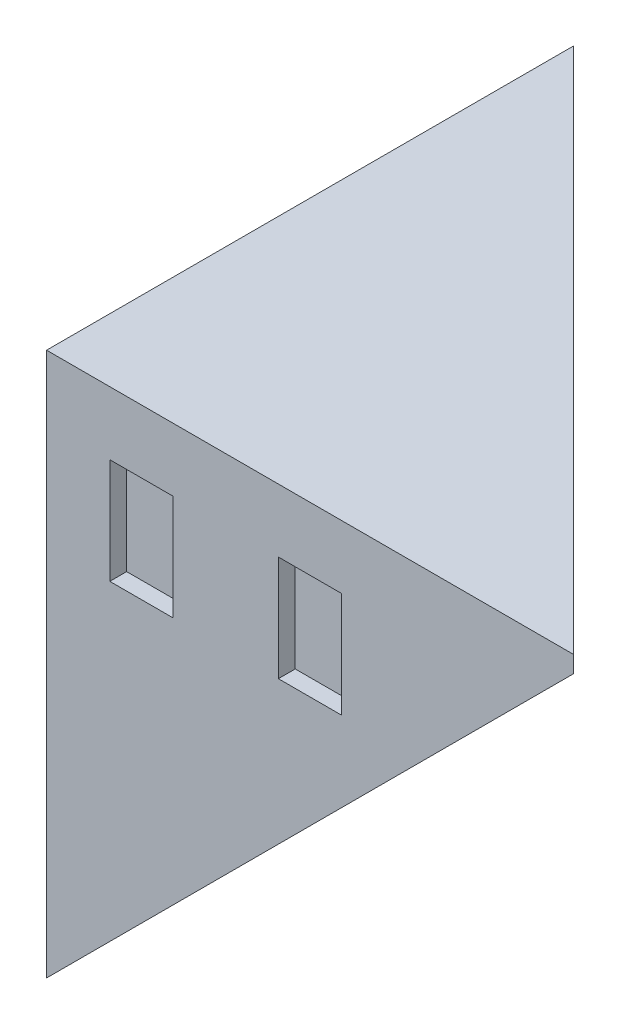
ISO-10303-21;
HEADER;
FILE_DESCRIPTION(('STEP AP214'),'2;1');
FILE_NAME('part.step','',(''),(''),'','','');
FILE_SCHEMA(('AUTOMOTIVE_DESIGN { 1 0 10303 214 1 1 1 1 }'));
ENDSEC;
DATA;
#1=APPLICATION_CONTEXT('core data for automotive mechanical design processes');
#2=APPLICATION_PROTOCOL_DEFINITION('international standard','automotive_design',2000,#1);
#3=PRODUCT_CONTEXT('',#1,'mechanical');
#4=PRODUCT('Part','Part','',(#3));
#5=PRODUCT_RELATED_PRODUCT_CATEGORY('part','',(#4));
#6=PRODUCT_DEFINITION_FORMATION('','',#4);
#7=PRODUCT_DEFINITION_CONTEXT('part definition',#1,'design');
#8=PRODUCT_DEFINITION('design','',#6,#7);
#9=PRODUCT_DEFINITION_SHAPE('','',#8);
#10=(LENGTH_UNIT() NAMED_UNIT(*) SI_UNIT(.MILLI.,.METRE.));
#11=(NAMED_UNIT(*) PLANE_ANGLE_UNIT() SI_UNIT($,.RADIAN.));
#12=(NAMED_UNIT(*) SI_UNIT($,.STERADIAN.) SOLID_ANGLE_UNIT());
#13=UNCERTAINTY_MEASURE_WITH_UNIT(LENGTH_MEASURE(1.E-05),#10,'distance_accuracy_value','');
#14=(GEOMETRIC_REPRESENTATION_CONTEXT(3) GLOBAL_UNCERTAINTY_ASSIGNED_CONTEXT((#13)) GLOBAL_UNIT_ASSIGNED_CONTEXT((#10,
#11,#12)) REPRESENTATION_CONTEXT('',''));
#15=CARTESIAN_POINT('',(0.,0.,0.));
#16=DIRECTION('',(0.,0.,1.));
#17=DIRECTION('',(1.,0.,0.));
#18=AXIS2_PLACEMENT_3D('',#15,#16,#17);
#19=CARTESIAN_POINT('',(0.,-16.,0.));
#20=DIRECTION('',(0.,-1.,0.));
#21=DIRECTION('',(0.,0.,-1.));
#22=AXIS2_PLACEMENT_3D('',#19,#20,#21);
#23=PLANE('',#22);
#24=DIRECTION('',(0.,0.,1.));
#25=VECTOR('',#24,1.);
#26=CARTESIAN_POINT('',(18.,-16.,-155.000000000004));
#27=LINE('',#26,#25);
#28=CARTESIAN_POINT('',(18.,-16.,-155.000000000004));
#29=VERTEX_POINT('',#28);
#30=CARTESIAN_POINT('',(18.,-16.,-18.));
#31=VERTEX_POINT('',#30);
#32=EDGE_CURVE('E61',#29,#31,#27,.T.);
#33=ORIENTED_EDGE('',*,*,#32,.F.);
#34=DIRECTION('',(-1.,0.,0.));
#35=VECTOR('',#34,1.);
#36=CARTESIAN_POINT('',(18.,-16.,-155.000000000004));
#37=LINE('',#36,#35);
#38=CARTESIAN_POINT('',(8.,-16.,-155.000000000004));
#39=VERTEX_POINT('',#38);
#40=EDGE_CURVE('E66',#29,#39,#37,.T.);
#41=ORIENTED_EDGE('',*,*,#40,.T.);
#42=DIRECTION('',(0.,0.,-1.));
#43=VECTOR('',#42,1.);
#44=CARTESIAN_POINT('',(8.,-16.,0.));
#45=LINE('',#44,#43);
#46=CARTESIAN_POINT('',(8.,-16.,-234.000000000008));
#47=VERTEX_POINT('',#46);
#48=EDGE_CURVE('E589',#39,#47,#45,.T.);
#49=ORIENTED_EDGE('',*,*,#48,.T.);
#50=DIRECTION('',(-0.707106781186535,0.,-0.70710678118656));
#51=VECTOR('',#50,1.);
#52=CARTESIAN_POINT('',(121.000000000004,-16.,-121.));
#53=LINE('',#52,#51);
#54=CARTESIAN_POINT('',(234.,-16.,-8.));
#55=VERTEX_POINT('',#54);
#56=EDGE_CURVE('E554',#55,#47,#53,.T.);
#57=ORIENTED_EDGE('',*,*,#56,.F.);
#58=DIRECTION('',(-1.,0.,0.));
#59=VECTOR('',#58,1.);
#60=CARTESIAN_POINT('',(0.,-16.,-8.));
#61=LINE('',#60,#59);
#62=CARTESIAN_POINT('',(155.000000000002,-16.,-8.));
#63=VERTEX_POINT('',#62);
#64=EDGE_CURVE('E584',#55,#63,#61,.T.);
#65=ORIENTED_EDGE('',*,*,#64,.T.);
#66=DIRECTION('',(0.,0.,1.));
#67=VECTOR('',#66,1.);
#68=CARTESIAN_POINT('',(155.000000000002,-16.,-18.));
#69=LINE('',#68,#67);
#70=CARTESIAN_POINT('',(155.000000000002,-16.,-18.));
#71=VERTEX_POINT('',#70);
#72=EDGE_CURVE('E432',#71,#63,#69,.T.);
#73=ORIENTED_EDGE('',*,*,#72,.F.);
#74=DIRECTION('',(1.,0.,0.));
#75=VECTOR('',#74,1.);
#76=CARTESIAN_POINT('',(8.,-16.,-18.));
#77=LINE('',#76,#75);
#78=EDGE_CURVE('E409',#31,#71,#77,.T.);
#79=ORIENTED_EDGE('',*,*,#78,.F.);
#80=EDGE_LOOP('',(#33,#41,#49,#57,#65,#73,#79));
#81=FACE_BOUND('',#80,.T.);
#82=ADVANCED_FACE('F45',(#81),#23,.T.);
#83=CARTESIAN_POINT('',(8.,0.,0.));
#84=DIRECTION('',(1.,0.,0.));
#85=DIRECTION('',(0.,0.,-1.));
#86=AXIS2_PLACEMENT_3D('',#83,#84,#85);
#87=PLANE('',#86);
#88=DIRECTION('',(0.,-0.707106781186539,0.707106781186556));
#89=VECTOR('',#88,1.);
#90=CARTESIAN_POINT('',(8.,-125.000000000004,-125.000000000001));
#91=LINE('',#90,#89);
#92=CARTESIAN_POINT('',(8.,-95.0000000000023,-155.000000000004));
#93=VERTEX_POINT('',#92);
#94=CARTESIAN_POINT('',(8.,-242.000000000003,-8.));
#95=VERTEX_POINT('',#94);
#96=EDGE_CURVE('E592',#93,#95,#91,.T.);
#97=ORIENTED_EDGE('',*,*,#96,.F.);
#98=DIRECTION('',(0.,0.,1.));
#99=VECTOR('',#98,1.);
#100=CARTESIAN_POINT('',(8.,-95.0000000000013,-18.));
#101=LINE('',#100,#99);
#102=CARTESIAN_POINT('',(8.,-95.0000000000013,-8.));
#103=VERTEX_POINT('',#102);
#104=EDGE_CURVE('E419',#93,#103,#101,.T.);
#105=ORIENTED_EDGE('',*,*,#104,.T.);
#106=DIRECTION('',(0.,1.,0.));
#107=VECTOR('',#106,1.);
#108=CARTESIAN_POINT('',(8.,0.,-8.));
#109=LINE('',#108,#107);
#110=EDGE_CURVE('E594',#95,#103,#109,.T.);
#111=ORIENTED_EDGE('',*,*,#110,.F.);
#112=EDGE_LOOP('',(#97,#105,#111));
#113=FACE_BOUND('',#112,.T.);
#114=ADVANCED_FACE('F667',(#113),#87,.T.);
#115=ORIENTED_EDGE('',*,*,#48,.F.);
#116=DIRECTION('',(0.,1.,0.));
#117=VECTOR('',#116,1.);
#118=CARTESIAN_POINT('',(8.,-95.0000000000042,-155.000000000004));
#119=LINE('',#118,#117);
#120=EDGE_CURVE('E311',#93,#39,#119,.T.);
#121=ORIENTED_EDGE('',*,*,#120,.F.);
#122=EDGE_CURVE('E599',#47,#93,#91,.T.);
#123=ORIENTED_EDGE('',*,*,#122,.F.);
#124=EDGE_LOOP('',(#115,#121,#123));
#125=FACE_BOUND('',#124,.T.);
#126=ADVANCED_FACE('F672',(#125),#87,.T.);
#127=CARTESIAN_POINT('',(0.,0.,-8.));
#128=DIRECTION('',(0.,0.,1.));
#129=DIRECTION('',(1.,0.,0.));
#130=AXIS2_PLACEMENT_3D('',#127,#128,#129);
#131=PLANE('',#130);
#132=DIRECTION('',(0.,-1.,0.));
#133=VECTOR('',#132,1.);
#134=CARTESIAN_POINT('',(155.000000000002,-16.,-8.));
#135=LINE('',#134,#133);
#136=CARTESIAN_POINT('',(155.,-95.0000000000013,-8.));
#137=VERTEX_POINT('',#136);
#138=EDGE_CURVE('E408',#63,#137,#135,.T.);
#139=ORIENTED_EDGE('',*,*,#138,.F.);
#140=ORIENTED_EDGE('',*,*,#64,.F.);
#141=DIRECTION('',(0.707106781186543,0.707106781186551,0.));
#142=VECTOR('',#141,1.);
#143=CARTESIAN_POINT('',(125.000000000001,-125.,-7.99999999999999));
#144=LINE('',#143,#142);
#145=EDGE_CURVE('E588',#137,#55,#144,.T.);
#146=ORIENTED_EDGE('',*,*,#145,.F.);
#147=EDGE_LOOP('',(#139,#140,#146));
#148=FACE_BOUND('',#147,.T.);
#149=ADVANCED_FACE('F676',(#148),#131,.F.);
#150=DIRECTION('',(-1.,0.,0.));
#151=VECTOR('',#150,1.);
#152=CARTESIAN_POINT('',(155.000000000002,-95.0000000000013,-8.));
#153=LINE('',#152,#151);
#154=EDGE_CURVE('E413',#137,#103,#153,.T.);
#155=ORIENTED_EDGE('',*,*,#154,.F.);
#156=EDGE_CURVE('E593',#95,#137,#144,.T.);
#157=ORIENTED_EDGE('',*,*,#156,.F.);
#158=ORIENTED_EDGE('',*,*,#110,.T.);
#159=EDGE_LOOP('',(#155,#157,#158));
#160=FACE_BOUND('',#159,.T.);
#161=ADVANCED_FACE('F678',(#160),#131,.F.);
#162=CARTESIAN_POINT('',(250.,-8.,0.));
#163=DIRECTION('',(0.,0.,1.));
#164=DIRECTION('',(1.,0.,0.));
#165=AXIS2_PLACEMENT_3D('',#162,#163,#164);
#166=PLANE('',#165);
#167=DIRECTION('',(0.,1.,0.));
#168=VECTOR('',#167,1.);
#169=CARTESIAN_POINT('',(140.,-30.,0.));
#170=LINE('',#169,#168);
#171=CARTESIAN_POINT('',(140.,-80.,0.));
#172=VERTEX_POINT('',#171);
#173=CARTESIAN_POINT('',(140.,-30.,0.));
#174=VERTEX_POINT('',#173);
#175=EDGE_CURVE('E450',#172,#174,#170,.T.);
#176=ORIENTED_EDGE('',*,*,#175,.F.);
#177=DIRECTION('',(1.,0.,0.));
#178=VECTOR('',#177,1.);
#179=CARTESIAN_POINT('',(140.,-80.,0.));
#180=LINE('',#179,#178);
#181=CARTESIAN_POINT('',(110.,-80.,0.));
#182=VERTEX_POINT('',#181);
#183=EDGE_CURVE('E463',#182,#172,#180,.T.);
#184=ORIENTED_EDGE('',*,*,#183,.F.);
#185=DIRECTION('',(0.,-1.,0.));
#186=VECTOR('',#185,1.);
#187=CARTESIAN_POINT('',(110.,-30.,0.));
#188=LINE('',#187,#186);
#189=CARTESIAN_POINT('',(110.,-30.,0.));
#190=VERTEX_POINT('',#189);
#191=EDGE_CURVE('E459',#190,#182,#188,.T.);
#192=ORIENTED_EDGE('',*,*,#191,.F.);
#193=DIRECTION('',(-1.,0.,0.));
#194=VECTOR('',#193,1.);
#195=CARTESIAN_POINT('',(140.,-30.,0.));
#196=LINE('',#195,#194);
#197=EDGE_CURVE('E454',#174,#190,#196,.T.);
#198=ORIENTED_EDGE('',*,*,#197,.F.);
#199=EDGE_LOOP('',(#176,#184,#192,#198));
#200=FACE_BOUND('',#199,.T.);
#201=DIRECTION('',(0.,1.,0.));
#202=VECTOR('',#201,1.);
#203=CARTESIAN_POINT('',(60.,-30.,0.));
#204=LINE('',#203,#202);
#205=CARTESIAN_POINT('',(60.,-79.9999999999998,0.));
#206=VERTEX_POINT('',#205);
#207=CARTESIAN_POINT('',(60.,-30.,0.));
#208=VERTEX_POINT('',#207);
#209=EDGE_CURVE('E436',#206,#208,#204,.T.);
#210=ORIENTED_EDGE('',*,*,#209,.F.);
#211=DIRECTION('',(1.,0.,0.));
#212=VECTOR('',#211,1.);
#213=CARTESIAN_POINT('',(60.,-79.9999999999998,0.));
#214=LINE('',#213,#212);
#215=CARTESIAN_POINT('',(30.,-79.9999999999998,0.));
#216=VERTEX_POINT('',#215);
#217=EDGE_CURVE('E500',#216,#206,#214,.T.);
#218=ORIENTED_EDGE('',*,*,#217,.F.);
#219=DIRECTION('',(0.,-1.,0.));
#220=VECTOR('',#219,1.);
#221=CARTESIAN_POINT('',(30.,-30.,0.));
#222=LINE('',#221,#220);
#223=CARTESIAN_POINT('',(30.,-30.,0.));
#224=VERTEX_POINT('',#223);
#225=EDGE_CURVE('E496',#224,#216,#222,.T.);
#226=ORIENTED_EDGE('',*,*,#225,.F.);
#227=DIRECTION('',(-1.,0.,0.));
#228=VECTOR('',#227,1.);
#229=CARTESIAN_POINT('',(60.,-30.,0.));
#230=LINE('',#229,#228);
#231=EDGE_CURVE('E492',#208,#224,#230,.T.);
#232=ORIENTED_EDGE('',*,*,#231,.F.);
#233=EDGE_LOOP('',(#210,#218,#226,#232));
#234=FACE_BOUND('',#233,.T.);
#235=DIRECTION('',(1.,0.,0.));
#236=VECTOR('',#235,1.);
#237=CARTESIAN_POINT('',(250.,0.,0.));
#238=LINE('',#237,#236);
#239=CARTESIAN_POINT('',(0.,0.,0.));
#240=VERTEX_POINT('',#239);
#241=CARTESIAN_POINT('',(250.,0.,0.));
#242=VERTEX_POINT('',#241);
#243=EDGE_CURVE('E613',#240,#242,#238,.T.);
#244=ORIENTED_EDGE('',*,*,#243,.F.);
#245=DIRECTION('',(0.,1.,0.));
#246=VECTOR('',#245,1.);
#247=CARTESIAN_POINT('',(0.,-8.,0.));
#248=LINE('',#247,#246);
#249=CARTESIAN_POINT('',(0.,-258.000000000001,0.));
#250=VERTEX_POINT('',#249);
#251=EDGE_CURVE('E54',#250,#240,#248,.T.);
#252=ORIENTED_EDGE('',*,*,#251,.F.);
#253=DIRECTION('',(0.707106781186544,0.707106781186552,0.));
#254=VECTOR('',#253,1.);
#255=CARTESIAN_POINT('',(0.,-258.000000000003,0.));
#256=LINE('',#255,#254);
#257=CARTESIAN_POINT('',(250.,-8.,0.));
#258=VERTEX_POINT('',#257);
#259=EDGE_CURVE('E614',#250,#258,#256,.T.);
#260=ORIENTED_EDGE('',*,*,#259,.T.);
#261=DIRECTION('',(0.,1.,0.));
#262=VECTOR('',#261,1.);
#263=CARTESIAN_POINT('',(250.,-8.,0.));
#264=LINE('',#263,#262);
#265=EDGE_CURVE('E632',#258,#242,#264,.T.);
#266=ORIENTED_EDGE('',*,*,#265,.T.);
#267=EDGE_LOOP('',(#244,#252,#260,#266));
#268=FACE_BOUND('',#267,.T.);
#269=ADVANCED_FACE('F47',(#200,#234,#268),#166,.T.);
#270=CARTESIAN_POINT('',(0.,-8.,0.));
#271=DIRECTION('',(-1.,0.,0.));
#272=DIRECTION('',(0.,0.,1.));
#273=AXIS2_PLACEMENT_3D('',#270,#271,#272);
#274=PLANE('',#273);
#275=DIRECTION('',(0.,0.,-1.));
#276=VECTOR('',#275,1.);
#277=CARTESIAN_POINT('',(0.,-30.,-30.));
#278=LINE('',#277,#276);
#279=CARTESIAN_POINT('',(0.,-30.,-30.));
#280=VERTEX_POINT('',#279);
#281=CARTESIAN_POINT('',(0.,-30.,-60.));
#282=VERTEX_POINT('',#281);
#283=EDGE_CURVE('E523',#280,#282,#278,.T.);
#284=ORIENTED_EDGE('',*,*,#283,.F.);
#285=DIRECTION('',(0.,1.,0.));
#286=VECTOR('',#285,1.);
#287=CARTESIAN_POINT('',(0.,-30.,-30.));
#288=LINE('',#287,#286);
#289=CARTESIAN_POINT('',(0.,-80.,-30.));
#290=VERTEX_POINT('',#289);
#291=EDGE_CURVE('E527',#290,#280,#288,.T.);
#292=ORIENTED_EDGE('',*,*,#291,.F.);
#293=DIRECTION('',(0.,0.,1.));
#294=VECTOR('',#293,1.);
#295=CARTESIAN_POINT('',(0.,-80.,-30.));
#296=LINE('',#295,#294);
#297=CARTESIAN_POINT('',(0.,-80.,-60.));
#298=VERTEX_POINT('',#297);
#299=EDGE_CURVE('E515',#298,#290,#296,.T.);
#300=ORIENTED_EDGE('',*,*,#299,.F.);
#301=DIRECTION('',(0.,-1.,0.));
#302=VECTOR('',#301,1.);
#303=CARTESIAN_POINT('',(0.,-30.,-60.));
#304=LINE('',#303,#302);
#305=EDGE_CURVE('E519',#282,#298,#304,.T.);
#306=ORIENTED_EDGE('',*,*,#305,.F.);
#307=EDGE_LOOP('',(#284,#292,#300,#306));
#308=FACE_BOUND('',#307,.T.);
#309=DIRECTION('',(0.,0.,-1.));
#310=VECTOR('',#309,1.);
#311=CARTESIAN_POINT('',(0.,-30.,-110.));
#312=LINE('',#311,#310);
#313=CARTESIAN_POINT('',(0.,-30.,-110.));
#314=VERTEX_POINT('',#313);
#315=CARTESIAN_POINT('',(0.,-30.,-140.));
#316=VERTEX_POINT('',#315);
#317=EDGE_CURVE('E563',#314,#316,#312,.T.);
#318=ORIENTED_EDGE('',*,*,#317,.F.);
#319=DIRECTION('',(0.,1.,0.));
#320=VECTOR('',#319,1.);
#321=CARTESIAN_POINT('',(0.,-30.,-110.));
#322=LINE('',#321,#320);
#323=CARTESIAN_POINT('',(0.,-80.,-110.));
#324=VERTEX_POINT('',#323);
#325=EDGE_CURVE('E449',#324,#314,#322,.T.);
#326=ORIENTED_EDGE('',*,*,#325,.F.);
#327=DIRECTION('',(0.,0.,1.));
#328=VECTOR('',#327,1.);
#329=CARTESIAN_POINT('',(0.,-80.,-110.));
#330=LINE('',#329,#328);
#331=CARTESIAN_POINT('',(0.,-80.,-140.));
#332=VERTEX_POINT('',#331);
#333=EDGE_CURVE('E555',#332,#324,#330,.T.);
#334=ORIENTED_EDGE('',*,*,#333,.F.);
#335=DIRECTION('',(0.,-1.,0.));
#336=VECTOR('',#335,1.);
#337=CARTESIAN_POINT('',(0.,-30.,-140.));
#338=LINE('',#337,#336);
#339=EDGE_CURVE('E559',#316,#332,#338,.T.);
#340=ORIENTED_EDGE('',*,*,#339,.F.);
#341=EDGE_LOOP('',(#318,#326,#334,#340));
#342=FACE_BOUND('',#341,.T.);
#343=DIRECTION('',(0.,0.,1.));
#344=VECTOR('',#343,1.);
#345=CARTESIAN_POINT('',(0.,0.,0.));
#346=LINE('',#345,#344);
#347=CARTESIAN_POINT('',(0.,0.,-250.));
#348=VERTEX_POINT('',#347);
#349=EDGE_CURVE('E628',#348,#240,#346,.T.);
#350=ORIENTED_EDGE('',*,*,#349,.F.);
#351=DIRECTION('',(0.,1.,0.));
#352=VECTOR('',#351,1.);
#353=CARTESIAN_POINT('',(0.,-8.,-250.));
#354=LINE('',#353,#352);
#355=CARTESIAN_POINT('',(0.,-8.,-250.));
#356=VERTEX_POINT('',#355);
#357=EDGE_CURVE('E635',#356,#348,#354,.T.);
#358=ORIENTED_EDGE('',*,*,#357,.F.);
#359=DIRECTION('',(0.,-0.707106781186539,0.707106781186556));
#360=VECTOR('',#359,1.);
#361=CARTESIAN_POINT('',(0.,-8.,-250.));
#362=LINE('',#361,#360);
#363=EDGE_CURVE('E609',#356,#250,#362,.T.);
#364=ORIENTED_EDGE('',*,*,#363,.T.);
#365=ORIENTED_EDGE('',*,*,#251,.T.);
#366=EDGE_LOOP('',(#350,#358,#364,#365));
#367=FACE_BOUND('',#366,.T.);
#368=ADVANCED_FACE('F650',(#308,#342,#367),#274,.T.);
#369=CARTESIAN_POINT('',(0.,-8.,-250.));
#370=DIRECTION('',(0.707106781186547,0.,-0.707106781186547));
#371=DIRECTION('',(-0.707106781186548,0.,-0.707106781186548));
#372=AXIS2_PLACEMENT_3D('',#369,#370,#371);
#373=PLANE('',#372);
#374=DIRECTION('',(-0.707106781186547,0.,-0.707106781186547));
#375=VECTOR('',#374,1.);
#376=CARTESIAN_POINT('',(0.,0.,-250.));
#377=LINE('',#376,#375);
#378=EDGE_CURVE('E624',#242,#348,#377,.T.);
#379=ORIENTED_EDGE('',*,*,#378,.F.);
#380=ORIENTED_EDGE('',*,*,#265,.F.);
#381=DIRECTION('',(-0.707106781186547,0.,-0.707106781186547));
#382=VECTOR('',#381,1.);
#383=CARTESIAN_POINT('',(0.,-8.,-250.));
#384=LINE('',#383,#382);
#385=EDGE_CURVE('E598',#258,#356,#384,.T.);
#386=ORIENTED_EDGE('',*,*,#385,.T.);
#387=ORIENTED_EDGE('',*,*,#357,.T.);
#388=EDGE_LOOP('',(#379,#380,#386,#387));
#389=FACE_BOUND('',#388,.T.);
#390=ADVANCED_FACE('F644',(#389),#373,.T.);
#391=CARTESIAN_POINT('',(0.,0.,0.));
#392=DIRECTION('',(0.,-1.,0.));
#393=DIRECTION('',(0.,0.,-1.));
#394=AXIS2_PLACEMENT_3D('',#391,#392,#393);
#395=PLANE('',#394);
#396=ORIENTED_EDGE('',*,*,#243,.T.);
#397=ORIENTED_EDGE('',*,*,#378,.T.);
#398=ORIENTED_EDGE('',*,*,#349,.T.);
#399=EDGE_LOOP('',(#396,#397,#398));
#400=FACE_BOUND('',#399,.T.);
#401=ADVANCED_FACE('F648',(#400),#395,.F.);
#402=CARTESIAN_POINT('',(86.0000000000026,-86.0000000000017,-85.9999999999996));
#403=DIRECTION('',(-0.577350269189635,0.577350269189628,0.577350269189614));
#404=DIRECTION('',(-0.707106781186543,-0.707106781186551,0.));
#405=AXIS2_PLACEMENT_3D('',#402,#403,#404);
#406=PLANE('',#405);
#407=ORIENTED_EDGE('',*,*,#56,.T.);
#408=ORIENTED_EDGE('',*,*,#122,.T.);
#409=ORIENTED_EDGE('',*,*,#96,.T.);
#410=ORIENTED_EDGE('',*,*,#156,.T.);
#411=ORIENTED_EDGE('',*,*,#145,.T.);
#412=EDGE_LOOP('',(#407,#408,#409,#410,#411));
#413=FACE_BOUND('',#412,.T.);
#414=ORIENTED_EDGE('',*,*,#363,.F.);
#415=ORIENTED_EDGE('',*,*,#385,.F.);
#416=ORIENTED_EDGE('',*,*,#259,.F.);
#417=EDGE_LOOP('',(#414,#415,#416));
#418=FACE_BOUND('',#417,.T.);
#419=ADVANCED_FACE('F652',(#413,#418),#406,.F.);
#420=CARTESIAN_POINT('',(66.309518948453,-30.,-110.));
#421=DIRECTION('',(0.,1.,0.));
#422=DIRECTION('',(0.,0.,1.));
#423=AXIS2_PLACEMENT_3D('',#420,#421,#422);
#424=PLANE('',#423);
#425=DIRECTION('',(-1.,0.,0.));
#426=VECTOR('',#425,1.);
#427=CARTESIAN_POINT('',(66.309518948453,-30.,-140.));
#428=LINE('',#427,#426);
#429=CARTESIAN_POINT('',(6.,-30.0000000000001,-140.));
#430=VERTEX_POINT('',#429);
#431=EDGE_CURVE('E558',#430,#316,#428,.T.);
#432=ORIENTED_EDGE('',*,*,#431,.F.);
#433=DIRECTION('',(0.,0.,-1.));
#434=VECTOR('',#433,1.);
#435=CARTESIAN_POINT('',(6.,-30.0000000000001,-140.));
#436=LINE('',#435,#434);
#437=CARTESIAN_POINT('',(6.,-30.0000000000001,-110.));
#438=VERTEX_POINT('',#437);
#439=EDGE_CURVE('E297',#438,#430,#436,.T.);
#440=ORIENTED_EDGE('',*,*,#439,.F.);
#441=DIRECTION('',(-1.,0.,0.));
#442=VECTOR('',#441,1.);
#443=CARTESIAN_POINT('',(66.309518948453,-30.,-110.));
#444=LINE('',#443,#442);
#445=EDGE_CURVE('E279',#438,#314,#444,.T.);
#446=ORIENTED_EDGE('',*,*,#445,.T.);
#447=ORIENTED_EDGE('',*,*,#317,.T.);
#448=EDGE_LOOP('',(#432,#440,#446,#447));
#449=FACE_BOUND('',#448,.T.);
#450=ADVANCED_FACE('F654',(#449),#424,.F.);
#451=CARTESIAN_POINT('',(66.309518948453,-30.,-140.));
#452=DIRECTION('',(0.,0.,-1.));
#453=DIRECTION('',(-1.,0.,0.));
#454=AXIS2_PLACEMENT_3D('',#451,#452,#453);
#455=PLANE('',#454);
#456=DIRECTION('',(0.,-1.,0.));
#457=VECTOR('',#456,1.);
#458=CARTESIAN_POINT('',(8.,-30.,-140.));
#459=LINE('',#458,#457);
#460=CARTESIAN_POINT('',(8.,-28.0000000000001,-140.));
#461=VERTEX_POINT('',#460);
#462=CARTESIAN_POINT('',(8.,-80.,-140.));
#463=VERTEX_POINT('',#462);
#464=EDGE_CURVE('E573',#461,#463,#459,.T.);
#465=ORIENTED_EDGE('',*,*,#464,.F.);
#466=DIRECTION('',(1.,0.,0.));
#467=VECTOR('',#466,1.);
#468=CARTESIAN_POINT('',(8.,-28.0000000000001,-140.));
#469=LINE('',#468,#467);
#470=CARTESIAN_POINT('',(6.,-28.0000000000001,-140.));
#471=VERTEX_POINT('',#470);
#472=EDGE_CURVE('E295',#471,#461,#469,.T.);
#473=ORIENTED_EDGE('',*,*,#472,.F.);
#474=DIRECTION('',(0.,-1.,0.));
#475=VECTOR('',#474,1.);
#476=CARTESIAN_POINT('',(6.,-28.0000000000001,-140.));
#477=LINE('',#476,#475);
#478=EDGE_CURVE('E308',#471,#430,#477,.T.);
#479=ORIENTED_EDGE('',*,*,#478,.T.);
#480=ORIENTED_EDGE('',*,*,#431,.T.);
#481=ORIENTED_EDGE('',*,*,#339,.T.);
#482=DIRECTION('',(-1.,0.,0.));
#483=VECTOR('',#482,1.);
#484=CARTESIAN_POINT('',(66.309518948453,-80.,-140.));
#485=LINE('',#484,#483);
#486=EDGE_CURVE('E572',#463,#332,#485,.T.);
#487=ORIENTED_EDGE('',*,*,#486,.F.);
#488=EDGE_LOOP('',(#465,#473,#479,#480,#481,#487));
#489=FACE_BOUND('',#488,.T.);
#490=ADVANCED_FACE('F661',(#489),#455,.F.);
#491=CARTESIAN_POINT('',(66.309518948453,-80.,-110.));
#492=DIRECTION('',(0.,-1.,0.));
#493=DIRECTION('',(0.,0.,-1.));
#494=AXIS2_PLACEMENT_3D('',#491,#492,#493);
#495=PLANE('',#494);
#496=ORIENTED_EDGE('',*,*,#486,.T.);
#497=ORIENTED_EDGE('',*,*,#333,.T.);
#498=DIRECTION('',(-1.,0.,0.));
#499=VECTOR('',#498,1.);
#500=CARTESIAN_POINT('',(66.309518948453,-80.,-110.));
#501=LINE('',#500,#499);
#502=CARTESIAN_POINT('',(8.,-80.,-110.));
#503=VERTEX_POINT('',#502);
#504=EDGE_CURVE('E280',#503,#324,#501,.T.);
#505=ORIENTED_EDGE('',*,*,#504,.F.);
#506=DIRECTION('',(0.,0.,1.));
#507=VECTOR('',#506,1.);
#508=CARTESIAN_POINT('',(8.,-80.,-110.));
#509=LINE('',#508,#507);
#510=EDGE_CURVE('E274',#463,#503,#509,.T.);
#511=ORIENTED_EDGE('',*,*,#510,.F.);
#512=EDGE_LOOP('',(#496,#497,#505,#511));
#513=FACE_BOUND('',#512,.T.);
#514=ADVANCED_FACE('F847',(#513),#495,.F.);
#515=CARTESIAN_POINT('',(66.309518948453,-30.,-110.));
#516=DIRECTION('',(0.,0.,1.));
#517=DIRECTION('',(1.,0.,0.));
#518=AXIS2_PLACEMENT_3D('',#515,#516,#517);
#519=PLANE('',#518);
#520=ORIENTED_EDGE('',*,*,#504,.T.);
#521=ORIENTED_EDGE('',*,*,#325,.T.);
#522=ORIENTED_EDGE('',*,*,#445,.F.);
#523=DIRECTION('',(0.,-1.,0.));
#524=VECTOR('',#523,1.);
#525=CARTESIAN_POINT('',(6.,-28.0000000000001,-110.));
#526=LINE('',#525,#524);
#527=CARTESIAN_POINT('',(6.,-28.0000000000001,-110.));
#528=VERTEX_POINT('',#527);
#529=EDGE_CURVE('E286',#528,#438,#526,.T.);
#530=ORIENTED_EDGE('',*,*,#529,.F.);
#531=DIRECTION('',(-1.,0.,0.));
#532=VECTOR('',#531,1.);
#533=CARTESIAN_POINT('',(8.,-28.0000000000001,-110.));
#534=LINE('',#533,#532);
#535=CARTESIAN_POINT('',(8.,-28.0000000000001,-110.));
#536=VERTEX_POINT('',#535);
#537=EDGE_CURVE('E283',#536,#528,#534,.T.);
#538=ORIENTED_EDGE('',*,*,#537,.F.);
#539=DIRECTION('',(0.,1.,0.));
#540=VECTOR('',#539,1.);
#541=CARTESIAN_POINT('',(8.,-30.,-110.));
#542=LINE('',#541,#540);
#543=EDGE_CURVE('E267',#503,#536,#542,.T.);
#544=ORIENTED_EDGE('',*,*,#543,.F.);
#545=EDGE_LOOP('',(#520,#521,#522,#530,#538,#544));
#546=FACE_BOUND('',#545,.T.);
#547=ADVANCED_FACE('F284',(#546),#519,.F.);
#548=CARTESIAN_POINT('',(66.309518948453,-30.,-30.));
#549=DIRECTION('',(0.,1.,0.));
#550=DIRECTION('',(0.,0.,1.));
#551=AXIS2_PLACEMENT_3D('',#548,#549,#550);
#552=PLANE('',#551);
#553=DIRECTION('',(-1.,0.,0.));
#554=VECTOR('',#553,1.);
#555=CARTESIAN_POINT('',(66.309518948453,-30.,-60.));
#556=LINE('',#555,#554);
#557=CARTESIAN_POINT('',(6.,-30.0000000000001,-60.));
#558=VERTEX_POINT('',#557);
#559=EDGE_CURVE('E518',#558,#282,#556,.T.);
#560=ORIENTED_EDGE('',*,*,#559,.F.);
#561=DIRECTION('',(0.,0.,-1.));
#562=VECTOR('',#561,1.);
#563=CARTESIAN_POINT('',(6.,-30.0000000000001,-60.));
#564=LINE('',#563,#562);
#565=CARTESIAN_POINT('',(6.,-30.0000000000001,-30.));
#566=VERTEX_POINT('',#565);
#567=EDGE_CURVE('E319',#566,#558,#564,.T.);
#568=ORIENTED_EDGE('',*,*,#567,.F.);
#569=DIRECTION('',(-1.,0.,0.));
#570=VECTOR('',#569,1.);
#571=CARTESIAN_POINT('',(66.309518948453,-30.,-30.));
#572=LINE('',#571,#570);
#573=EDGE_CURVE('E534',#566,#280,#572,.T.);
#574=ORIENTED_EDGE('',*,*,#573,.T.);
#575=ORIENTED_EDGE('',*,*,#283,.T.);
#576=EDGE_LOOP('',(#560,#568,#574,#575));
#577=FACE_BOUND('',#576,.T.);
#578=ADVANCED_FACE('F840',(#577),#552,.F.);
#579=CARTESIAN_POINT('',(66.309518948453,-30.,-60.));
#580=DIRECTION('',(0.,0.,-1.));
#581=DIRECTION('',(0.,1.,0.));
#582=AXIS2_PLACEMENT_3D('',#579,#580,#581);
#583=PLANE('',#582);
#584=DIRECTION('',(0.,-1.,0.));
#585=VECTOR('',#584,1.);
#586=CARTESIAN_POINT('',(8.,-30.,-60.));
#587=LINE('',#586,#585);
#588=CARTESIAN_POINT('',(8.,-28.0000000000001,-60.));
#589=VERTEX_POINT('',#588);
#590=CARTESIAN_POINT('',(8.,-80.,-60.));
#591=VERTEX_POINT('',#590);
#592=EDGE_CURVE('E541',#589,#591,#587,.T.);
#593=ORIENTED_EDGE('',*,*,#592,.F.);
#594=DIRECTION('',(1.,0.,0.));
#595=VECTOR('',#594,1.);
#596=CARTESIAN_POINT('',(8.,-28.0000000000001,-60.));
#597=LINE('',#596,#595);
#598=CARTESIAN_POINT('',(6.,-28.0000000000001,-60.));
#599=VERTEX_POINT('',#598);
#600=EDGE_CURVE('E327',#599,#589,#597,.T.);
#601=ORIENTED_EDGE('',*,*,#600,.F.);
#602=DIRECTION('',(0.,-1.,0.));
#603=VECTOR('',#602,1.);
#604=CARTESIAN_POINT('',(6.,-28.0000000000001,-60.));
#605=LINE('',#604,#603);
#606=EDGE_CURVE('E301',#599,#558,#605,.T.);
#607=ORIENTED_EDGE('',*,*,#606,.T.);
#608=ORIENTED_EDGE('',*,*,#559,.T.);
#609=ORIENTED_EDGE('',*,*,#305,.T.);
#610=DIRECTION('',(-1.,0.,0.));
#611=VECTOR('',#610,1.);
#612=CARTESIAN_POINT('',(66.309518948453,-80.,-60.));
#613=LINE('',#612,#611);
#614=EDGE_CURVE('E540',#591,#298,#613,.T.);
#615=ORIENTED_EDGE('',*,*,#614,.F.);
#616=EDGE_LOOP('',(#593,#601,#607,#608,#609,#615));
#617=FACE_BOUND('',#616,.T.);
#618=ADVANCED_FACE('F836',(#617),#583,.F.);
#619=CARTESIAN_POINT('',(66.309518948453,-80.,-30.));
#620=DIRECTION('',(0.,-1.,0.));
#621=DIRECTION('',(0.,0.,-1.));
#622=AXIS2_PLACEMENT_3D('',#619,#620,#621);
#623=PLANE('',#622);
#624=ORIENTED_EDGE('',*,*,#614,.T.);
#625=ORIENTED_EDGE('',*,*,#299,.T.);
#626=DIRECTION('',(-1.,0.,0.));
#627=VECTOR('',#626,1.);
#628=CARTESIAN_POINT('',(66.309518948453,-80.,-30.));
#629=LINE('',#628,#627);
#630=CARTESIAN_POINT('',(8.,-80.,-30.));
#631=VERTEX_POINT('',#630);
#632=EDGE_CURVE('E535',#631,#290,#629,.T.);
#633=ORIENTED_EDGE('',*,*,#632,.F.);
#634=DIRECTION('',(0.,0.,1.));
#635=VECTOR('',#634,1.);
#636=CARTESIAN_POINT('',(8.,-80.,-30.));
#637=LINE('',#636,#635);
#638=EDGE_CURVE('E536',#591,#631,#637,.T.);
#639=ORIENTED_EDGE('',*,*,#638,.F.);
#640=EDGE_LOOP('',(#624,#625,#633,#639));
#641=FACE_BOUND('',#640,.T.);
#642=ADVANCED_FACE('F832',(#641),#623,.F.);
#643=CARTESIAN_POINT('',(66.309518948453,-30.,-30.));
#644=DIRECTION('',(0.,0.,1.));
#645=DIRECTION('',(0.,-1.,0.));
#646=AXIS2_PLACEMENT_3D('',#643,#644,#645);
#647=PLANE('',#646);
#648=ORIENTED_EDGE('',*,*,#632,.T.);
#649=ORIENTED_EDGE('',*,*,#291,.T.);
#650=ORIENTED_EDGE('',*,*,#573,.F.);
#651=DIRECTION('',(0.,-1.,0.));
#652=VECTOR('',#651,1.);
#653=CARTESIAN_POINT('',(6.,-28.0000000000001,-30.));
#654=LINE('',#653,#652);
#655=CARTESIAN_POINT('',(6.,-28.0000000000001,-30.));
#656=VERTEX_POINT('',#655);
#657=EDGE_CURVE('E331',#656,#566,#654,.T.);
#658=ORIENTED_EDGE('',*,*,#657,.F.);
#659=DIRECTION('',(-1.,0.,0.));
#660=VECTOR('',#659,1.);
#661=CARTESIAN_POINT('',(8.,-28.0000000000001,-30.));
#662=LINE('',#661,#660);
#663=CARTESIAN_POINT('',(8.,-28.0000000000001,-30.));
#664=VERTEX_POINT('',#663);
#665=EDGE_CURVE('E318',#664,#656,#662,.T.);
#666=ORIENTED_EDGE('',*,*,#665,.F.);
#667=DIRECTION('',(0.,1.,0.));
#668=VECTOR('',#667,1.);
#669=CARTESIAN_POINT('',(8.,-30.,-30.));
#670=LINE('',#669,#668);
#671=EDGE_CURVE('E531',#631,#664,#670,.T.);
#672=ORIENTED_EDGE('',*,*,#671,.F.);
#673=EDGE_LOOP('',(#648,#649,#650,#658,#666,#672));
#674=FACE_BOUND('',#673,.T.);
#675=ADVANCED_FACE('F828',(#674),#647,.F.);
#676=CARTESIAN_POINT('',(60.,-30.,-66.3095189484532));
#677=DIRECTION('',(1.,0.,0.));
#678=DIRECTION('',(0.,1.,0.));
#679=AXIS2_PLACEMENT_3D('',#676,#677,#678);
#680=PLANE('',#679);
#681=DIRECTION('',(0.,-1.,0.));
#682=VECTOR('',#681,1.);
#683=CARTESIAN_POINT('',(60.,-30.,-8.));
#684=LINE('',#683,#682);
#685=CARTESIAN_POINT('',(60.,-28.0000000000001,-8.00000000000002));
#686=VERTEX_POINT('',#685);
#687=CARTESIAN_POINT('',(60.,-79.9999999999998,-8.));
#688=VERTEX_POINT('',#687);
#689=EDGE_CURVE('E455',#686,#688,#684,.T.);
#690=ORIENTED_EDGE('',*,*,#689,.T.);
#691=DIRECTION('',(0.,0.,1.));
#692=VECTOR('',#691,1.);
#693=CARTESIAN_POINT('',(60.,-79.9999999999998,-66.3095189484532));
#694=LINE('',#693,#692);
#695=EDGE_CURVE('E482',#688,#206,#694,.T.);
#696=ORIENTED_EDGE('',*,*,#695,.T.);
#697=ORIENTED_EDGE('',*,*,#209,.T.);
#698=DIRECTION('',(0.,0.,1.));
#699=VECTOR('',#698,1.);
#700=CARTESIAN_POINT('',(60.,-30.,-66.3095189484532));
#701=LINE('',#700,#699);
#702=CARTESIAN_POINT('',(60.,-30.0000000000001,-6.00000000000001));
#703=VERTEX_POINT('',#702);
#704=EDGE_CURVE('E504',#703,#208,#701,.T.);
#705=ORIENTED_EDGE('',*,*,#704,.F.);
#706=DIRECTION('',(0.,-1.,0.));
#707=VECTOR('',#706,1.);
#708=CARTESIAN_POINT('',(60.,-28.0000000000001,-6.00000000000001));
#709=LINE('',#708,#707);
#710=CARTESIAN_POINT('',(60.,-28.0000000000001,-6.00000000000001));
#711=VERTEX_POINT('',#710);
#712=EDGE_CURVE('E357',#711,#703,#709,.T.);
#713=ORIENTED_EDGE('',*,*,#712,.F.);
#714=DIRECTION('',(0.,0.,1.));
#715=VECTOR('',#714,1.);
#716=CARTESIAN_POINT('',(60.,-28.0000000000001,-8.00000000000002));
#717=LINE('',#716,#715);
#718=EDGE_CURVE('E349',#686,#711,#717,.T.);
#719=ORIENTED_EDGE('',*,*,#718,.F.);
#720=EDGE_LOOP('',(#690,#696,#697,#705,#713,#719));
#721=FACE_BOUND('',#720,.T.);
#722=ADVANCED_FACE('F818',(#721),#680,.F.);
#723=CARTESIAN_POINT('',(60.,-79.9999999999998,-66.3095189484532));
#724=DIRECTION('',(0.,-1.,0.));
#725=DIRECTION('',(0.,0.,-1.));
#726=AXIS2_PLACEMENT_3D('',#723,#724,#725);
#727=PLANE('',#726);
#728=DIRECTION('',(-1.,0.,0.));
#729=VECTOR('',#728,1.);
#730=CARTESIAN_POINT('',(60.,-79.9999999999998,-8.));
#731=LINE('',#730,#729);
#732=CARTESIAN_POINT('',(30.,-79.9999999999998,-8.));
#733=VERTEX_POINT('',#732);
#734=EDGE_CURVE('E481',#688,#733,#731,.T.);
#735=ORIENTED_EDGE('',*,*,#734,.T.);
#736=DIRECTION('',(0.,0.,1.));
#737=VECTOR('',#736,1.);
#738=CARTESIAN_POINT('',(30.,-79.9999999999998,-66.3095189484532));
#739=LINE('',#738,#737);
#740=EDGE_CURVE('E507',#733,#216,#739,.T.);
#741=ORIENTED_EDGE('',*,*,#740,.T.);
#742=ORIENTED_EDGE('',*,*,#217,.T.);
#743=ORIENTED_EDGE('',*,*,#695,.F.);
#744=EDGE_LOOP('',(#735,#741,#742,#743));
#745=FACE_BOUND('',#744,.T.);
#746=ADVANCED_FACE('F814',(#745),#727,.F.);
#747=CARTESIAN_POINT('',(30.,-30.,-66.3095189484532));
#748=DIRECTION('',(-1.,0.,0.));
#749=DIRECTION('',(0.,0.,1.));
#750=AXIS2_PLACEMENT_3D('',#747,#748,#749);
#751=PLANE('',#750);
#752=DIRECTION('',(0.,1.,0.));
#753=VECTOR('',#752,1.);
#754=CARTESIAN_POINT('',(30.,-30.,-8.));
#755=LINE('',#754,#753);
#756=CARTESIAN_POINT('',(30.,-28.0000000000001,-8.00000000000002));
#757=VERTEX_POINT('',#756);
#758=EDGE_CURVE('E478',#733,#757,#755,.T.);
#759=ORIENTED_EDGE('',*,*,#758,.T.);
#760=DIRECTION('',(0.,0.,-1.));
#761=VECTOR('',#760,1.);
#762=CARTESIAN_POINT('',(30.,-28.0000000000001,-8.00000000000002));
#763=LINE('',#762,#761);
#764=CARTESIAN_POINT('',(30.,-28.0000000000001,-6.00000000000002));
#765=VERTEX_POINT('',#764);
#766=EDGE_CURVE('E340',#765,#757,#763,.T.);
#767=ORIENTED_EDGE('',*,*,#766,.F.);
#768=DIRECTION('',(0.,-1.,0.));
#769=VECTOR('',#768,1.);
#770=CARTESIAN_POINT('',(30.,-28.0000000000001,-6.00000000000002));
#771=LINE('',#770,#769);
#772=CARTESIAN_POINT('',(30.,-30.0000000000001,-6.00000000000002));
#773=VERTEX_POINT('',#772);
#774=EDGE_CURVE('E335',#765,#773,#771,.T.);
#775=ORIENTED_EDGE('',*,*,#774,.T.);
#776=DIRECTION('',(0.,0.,1.));
#777=VECTOR('',#776,1.);
#778=CARTESIAN_POINT('',(30.,-30.,-66.3095189484532));
#779=LINE('',#778,#777);
#780=EDGE_CURVE('E510',#773,#224,#779,.T.);
#781=ORIENTED_EDGE('',*,*,#780,.T.);
#782=ORIENTED_EDGE('',*,*,#225,.T.);
#783=ORIENTED_EDGE('',*,*,#740,.F.);
#784=EDGE_LOOP('',(#759,#767,#775,#781,#782,#783));
#785=FACE_BOUND('',#784,.T.);
#786=ADVANCED_FACE('F817',(#785),#751,.F.);
#787=CARTESIAN_POINT('',(60.,-30.,-66.3095189484532));
#788=DIRECTION('',(0.,1.,0.));
#789=DIRECTION('',(-1.,0.,0.));
#790=AXIS2_PLACEMENT_3D('',#787,#788,#789);
#791=PLANE('',#790);
#792=ORIENTED_EDGE('',*,*,#780,.F.);
#793=DIRECTION('',(-1.,0.,0.));
#794=VECTOR('',#793,1.);
#795=CARTESIAN_POINT('',(30.,-30.0000000000001,-6.00000000000002));
#796=LINE('',#795,#794);
#797=EDGE_CURVE('E345',#703,#773,#796,.T.);
#798=ORIENTED_EDGE('',*,*,#797,.F.);
#799=ORIENTED_EDGE('',*,*,#704,.T.);
#800=ORIENTED_EDGE('',*,*,#231,.T.);
#801=EDGE_LOOP('',(#792,#798,#799,#800));
#802=FACE_BOUND('',#801,.T.);
#803=ADVANCED_FACE('F812',(#802),#791,.F.);
#804=CARTESIAN_POINT('',(140.,-30.,-66.3095189484532));
#805=DIRECTION('',(1.,0.,0.));
#806=DIRECTION('',(0.,0.,-1.));
#807=AXIS2_PLACEMENT_3D('',#804,#805,#806);
#808=PLANE('',#807);
#809=DIRECTION('',(0.,-1.,0.));
#810=VECTOR('',#809,1.);
#811=CARTESIAN_POINT('',(140.,-30.,-8.));
#812=LINE('',#811,#810);
#813=CARTESIAN_POINT('',(140.,-28.0000000000001,-8.00000000000002));
#814=VERTEX_POINT('',#813);
#815=CARTESIAN_POINT('',(140.,-80.,-8.));
#816=VERTEX_POINT('',#815);
#817=EDGE_CURVE('E445',#814,#816,#812,.T.);
#818=ORIENTED_EDGE('',*,*,#817,.T.);
#819=DIRECTION('',(0.,0.,1.));
#820=VECTOR('',#819,1.);
#821=CARTESIAN_POINT('',(140.,-80.,-66.3095189484532));
#822=LINE('',#821,#820);
#823=EDGE_CURVE('E441',#816,#172,#822,.T.);
#824=ORIENTED_EDGE('',*,*,#823,.T.);
#825=ORIENTED_EDGE('',*,*,#175,.T.);
#826=DIRECTION('',(0.,0.,1.));
#827=VECTOR('',#826,1.);
#828=CARTESIAN_POINT('',(140.,-30.,-66.3095189484532));
#829=LINE('',#828,#827);
#830=CARTESIAN_POINT('',(140.,-30.0000000000001,-6.00000000000001));
#831=VERTEX_POINT('',#830);
#832=EDGE_CURVE('E467',#831,#174,#829,.T.);
#833=ORIENTED_EDGE('',*,*,#832,.F.);
#834=DIRECTION('',(0.,-1.,0.));
#835=VECTOR('',#834,1.);
#836=CARTESIAN_POINT('',(140.,-28.0000000000001,-6.00000000000001));
#837=LINE('',#836,#835);
#838=CARTESIAN_POINT('',(140.,-28.0000000000001,-6.00000000000001));
#839=VERTEX_POINT('',#838);
#840=EDGE_CURVE('E383',#839,#831,#837,.T.);
#841=ORIENTED_EDGE('',*,*,#840,.F.);
#842=DIRECTION('',(0.,0.,1.));
#843=VECTOR('',#842,1.);
#844=CARTESIAN_POINT('',(140.,-28.0000000000001,-8.00000000000002));
#845=LINE('',#844,#843);
#846=EDGE_CURVE('E375',#814,#839,#845,.T.);
#847=ORIENTED_EDGE('',*,*,#846,.F.);
#848=EDGE_LOOP('',(#818,#824,#825,#833,#841,#847));
#849=FACE_BOUND('',#848,.T.);
#850=ADVANCED_FACE('F800',(#849),#808,.F.);
#851=CARTESIAN_POINT('',(140.,-80.,-66.3095189484532));
#852=DIRECTION('',(0.,-1.,0.));
#853=DIRECTION('',(0.,0.,-1.));
#854=AXIS2_PLACEMENT_3D('',#851,#852,#853);
#855=PLANE('',#854);
#856=DIRECTION('',(-1.,0.,0.));
#857=VECTOR('',#856,1.);
#858=CARTESIAN_POINT('',(140.,-80.,-8.));
#859=LINE('',#858,#857);
#860=CARTESIAN_POINT('',(110.,-80.,-8.));
#861=VERTEX_POINT('',#860);
#862=EDGE_CURVE('E440',#816,#861,#859,.T.);
#863=ORIENTED_EDGE('',*,*,#862,.T.);
#864=DIRECTION('',(0.,0.,1.));
#865=VECTOR('',#864,1.);
#866=CARTESIAN_POINT('',(110.,-80.,-66.3095189484532));
#867=LINE('',#866,#865);
#868=EDGE_CURVE('E470',#861,#182,#867,.T.);
#869=ORIENTED_EDGE('',*,*,#868,.T.);
#870=ORIENTED_EDGE('',*,*,#183,.T.);
#871=ORIENTED_EDGE('',*,*,#823,.F.);
#872=EDGE_LOOP('',(#863,#869,#870,#871));
#873=FACE_BOUND('',#872,.T.);
#874=ADVANCED_FACE('F796',(#873),#855,.F.);
#875=CARTESIAN_POINT('',(110.,-30.,-66.3095189484532));
#876=DIRECTION('',(-1.,0.,0.));
#877=DIRECTION('',(0.,0.,1.));
#878=AXIS2_PLACEMENT_3D('',#875,#876,#877);
#879=PLANE('',#878);
#880=DIRECTION('',(0.,1.,0.));
#881=VECTOR('',#880,1.);
#882=CARTESIAN_POINT('',(110.,-30.,-8.));
#883=LINE('',#882,#881);
#884=CARTESIAN_POINT('',(110.,-28.0000000000001,-8.00000000000002));
#885=VERTEX_POINT('',#884);
#886=EDGE_CURVE('E437',#861,#885,#883,.T.);
#887=ORIENTED_EDGE('',*,*,#886,.T.);
#888=DIRECTION('',(0.,0.,-1.));
#889=VECTOR('',#888,1.);
#890=CARTESIAN_POINT('',(110.,-28.0000000000001,-8.00000000000002));
#891=LINE('',#890,#889);
#892=CARTESIAN_POINT('',(110.,-28.0000000000001,-6.00000000000002));
#893=VERTEX_POINT('',#892);
#894=EDGE_CURVE('E366',#893,#885,#891,.T.);
#895=ORIENTED_EDGE('',*,*,#894,.F.);
#896=DIRECTION('',(0.,-1.,0.));
#897=VECTOR('',#896,1.);
#898=CARTESIAN_POINT('',(110.,-28.0000000000001,-6.00000000000002));
#899=LINE('',#898,#897);
#900=CARTESIAN_POINT('',(110.,-30.0000000000001,-6.00000000000002));
#901=VERTEX_POINT('',#900);
#902=EDGE_CURVE('E361',#893,#901,#899,.T.);
#903=ORIENTED_EDGE('',*,*,#902,.T.);
#904=DIRECTION('',(0.,0.,1.));
#905=VECTOR('',#904,1.);
#906=CARTESIAN_POINT('',(110.,-30.,-66.3095189484532));
#907=LINE('',#906,#905);
#908=EDGE_CURVE('E473',#901,#190,#907,.T.);
#909=ORIENTED_EDGE('',*,*,#908,.T.);
#910=ORIENTED_EDGE('',*,*,#191,.T.);
#911=ORIENTED_EDGE('',*,*,#868,.F.);
#912=EDGE_LOOP('',(#887,#895,#903,#909,#910,#911));
#913=FACE_BOUND('',#912,.T.);
#914=ADVANCED_FACE('F799',(#913),#879,.F.);
#915=CARTESIAN_POINT('',(140.,-30.,-66.3095189484532));
#916=DIRECTION('',(0.,1.,0.));
#917=DIRECTION('',(-1.,0.,0.));
#918=AXIS2_PLACEMENT_3D('',#915,#916,#917);
#919=PLANE('',#918);
#920=ORIENTED_EDGE('',*,*,#908,.F.);
#921=DIRECTION('',(-1.,0.,0.));
#922=VECTOR('',#921,1.);
#923=CARTESIAN_POINT('',(110.,-30.0000000000001,-6.00000000000002));
#924=LINE('',#923,#922);
#925=EDGE_CURVE('E371',#831,#901,#924,.T.);
#926=ORIENTED_EDGE('',*,*,#925,.F.);
#927=ORIENTED_EDGE('',*,*,#832,.T.);
#928=ORIENTED_EDGE('',*,*,#197,.T.);
#929=EDGE_LOOP('',(#920,#926,#927,#928));
#930=FACE_BOUND('',#929,.T.);
#931=ADVANCED_FACE('F804',(#930),#919,.F.);
#932=CARTESIAN_POINT('',(0.,0.,-8.));
#933=DIRECTION('',(0.,0.,-1.));
#934=DIRECTION('',(-1.,0.,0.));
#935=AXIS2_PLACEMENT_3D('',#932,#933,#934);
#936=PLANE('',#935);
#937=ORIENTED_EDGE('',*,*,#862,.F.);
#938=ORIENTED_EDGE('',*,*,#817,.F.);
#939=DIRECTION('',(1.,0.,0.));
#940=VECTOR('',#939,1.);
#941=CARTESIAN_POINT('',(110.,-28.0000000000001,-8.00000000000002));
#942=LINE('',#941,#940);
#943=EDGE_CURVE('E370',#885,#814,#942,.T.);
#944=ORIENTED_EDGE('',*,*,#943,.F.);
#945=ORIENTED_EDGE('',*,*,#886,.F.);
#946=EDGE_LOOP('',(#937,#938,#944,#945));
#947=FACE_BOUND('',#946,.T.);
#948=ADVANCED_FACE('F808',(#947),#936,.F.);
#949=ORIENTED_EDGE('',*,*,#734,.F.);
#950=ORIENTED_EDGE('',*,*,#689,.F.);
#951=DIRECTION('',(1.,0.,0.));
#952=VECTOR('',#951,1.);
#953=CARTESIAN_POINT('',(30.,-28.0000000000001,-8.00000000000002));
#954=LINE('',#953,#952);
#955=EDGE_CURVE('E344',#757,#686,#954,.T.);
#956=ORIENTED_EDGE('',*,*,#955,.F.);
#957=ORIENTED_EDGE('',*,*,#758,.F.);
#958=EDGE_LOOP('',(#949,#950,#956,#957));
#959=FACE_BOUND('',#958,.T.);
#960=ADVANCED_FACE('F792',(#959),#936,.F.);
#961=CARTESIAN_POINT('',(155.000000000002,-16.,-18.));
#962=DIRECTION('',(-1.,0.,0.));
#963=DIRECTION('',(0.,0.,1.));
#964=AXIS2_PLACEMENT_3D('',#961,#962,#963);
#965=PLANE('',#964);
#966=ORIENTED_EDGE('',*,*,#138,.T.);
#967=DIRECTION('',(0.,0.,1.));
#968=VECTOR('',#967,1.);
#969=CARTESIAN_POINT('',(155.000000000002,-95.0000000000013,-18.));
#970=LINE('',#969,#968);
#971=CARTESIAN_POINT('',(155.000000000002,-95.0000000000013,-18.));
#972=VERTEX_POINT('',#971);
#973=EDGE_CURVE('E428',#972,#137,#970,.T.);
#974=ORIENTED_EDGE('',*,*,#973,.F.);
#975=DIRECTION('',(0.,-1.,0.));
#976=VECTOR('',#975,1.);
#977=CARTESIAN_POINT('',(155.000000000002,-16.,-18.));
#978=LINE('',#977,#976);
#979=EDGE_CURVE('E412',#71,#972,#978,.T.);
#980=ORIENTED_EDGE('',*,*,#979,.F.);
#981=ORIENTED_EDGE('',*,*,#72,.T.);
#982=EDGE_LOOP('',(#966,#974,#980,#981));
#983=FACE_BOUND('',#982,.T.);
#984=ADVANCED_FACE('F693',(#983),#965,.F.);
#985=CARTESIAN_POINT('',(155.000000000002,-95.0000000000013,-18.));
#986=DIRECTION('',(0.,1.,0.));
#987=DIRECTION('',(0.,0.,1.));
#988=AXIS2_PLACEMENT_3D('',#985,#986,#987);
#989=PLANE('',#988);
#990=ORIENTED_EDGE('',*,*,#154,.T.);
#991=ORIENTED_EDGE('',*,*,#104,.F.);
#992=DIRECTION('',(-1.,0.,0.));
#993=VECTOR('',#992,1.);
#994=CARTESIAN_POINT('',(18.,-95.0000000000042,-155.000000000004));
#995=LINE('',#994,#993);
#996=CARTESIAN_POINT('',(18.,-95.0000000000042,-155.000000000004));
#997=VERTEX_POINT('',#996);
#998=EDGE_CURVE('E404',#997,#93,#995,.T.);
#999=ORIENTED_EDGE('',*,*,#998,.F.);
#1000=DIRECTION('',(0.,0.,-1.));
#1001=VECTOR('',#1000,1.);
#1002=CARTESIAN_POINT('',(18.,-95.0000000000042,-8.));
#1003=LINE('',#1002,#1001);
#1004=CARTESIAN_POINT('',(18.,-95.0000000000042,-18.));
#1005=VERTEX_POINT('',#1004);
#1006=EDGE_CURVE('E391',#1005,#997,#1003,.T.);
#1007=ORIENTED_EDGE('',*,*,#1006,.F.);
#1008=DIRECTION('',(-1.,0.,0.));
#1009=VECTOR('',#1008,1.);
#1010=CARTESIAN_POINT('',(155.000000000002,-95.0000000000013,-18.));
#1011=LINE('',#1010,#1009);
#1012=EDGE_CURVE('E416',#972,#1005,#1011,.T.);
#1013=ORIENTED_EDGE('',*,*,#1012,.F.);
#1014=ORIENTED_EDGE('',*,*,#973,.T.);
#1015=EDGE_LOOP('',(#990,#991,#999,#1007,#1013,#1014));
#1016=FACE_BOUND('',#1015,.T.);
#1017=ADVANCED_FACE('F784',(#1016),#989,.F.);
#1018=CARTESIAN_POINT('',(0.,0.,-18.));
#1019=DIRECTION('',(0.,0.,-1.));
#1020=DIRECTION('',(-1.,0.,0.));
#1021=AXIS2_PLACEMENT_3D('',#1018,#1019,#1020);
#1022=PLANE('',#1021);
#1023=DIRECTION('',(0.,-1.,0.));
#1024=VECTOR('',#1023,1.);
#1025=CARTESIAN_POINT('',(18.,0.,-18.));
#1026=LINE('',#1025,#1024);
#1027=EDGE_CURVE('E11',#31,#1005,#1026,.T.);
#1028=ORIENTED_EDGE('',*,*,#1027,.F.);
#1029=ORIENTED_EDGE('',*,*,#78,.T.);
#1030=ORIENTED_EDGE('',*,*,#979,.T.);
#1031=ORIENTED_EDGE('',*,*,#1012,.T.);
#1032=EDGE_LOOP('',(#1028,#1029,#1030,#1031));
#1033=FACE_BOUND('',#1032,.T.);
#1034=ADVANCED_FACE('F696',(#1033),#1022,.T.);
#1035=CARTESIAN_POINT('',(18.,0.,0.));
#1036=DIRECTION('',(1.,0.,0.));
#1037=DIRECTION('',(0.,0.,-1.));
#1038=AXIS2_PLACEMENT_3D('',#1035,#1036,#1037);
#1039=PLANE('',#1038);
#1040=ORIENTED_EDGE('',*,*,#32,.T.);
#1041=ORIENTED_EDGE('',*,*,#1027,.T.);
#1042=ORIENTED_EDGE('',*,*,#1006,.T.);
#1043=DIRECTION('',(0.,1.,0.));
#1044=VECTOR('',#1043,1.);
#1045=CARTESIAN_POINT('',(18.,-95.0000000000042,-155.000000000004));
#1046=LINE('',#1045,#1044);
#1047=EDGE_CURVE('E394',#997,#29,#1046,.T.);
#1048=ORIENTED_EDGE('',*,*,#1047,.T.);
#1049=EDGE_LOOP('',(#1040,#1041,#1042,#1048));
#1050=FACE_BOUND('',#1049,.T.);
#1051=ADVANCED_FACE('F698',(#1050),#1039,.T.);
#1052=CARTESIAN_POINT('',(18.,-95.0000000000042,-155.000000000004));
#1053=DIRECTION('',(0.,0.,1.));
#1054=DIRECTION('',(0.,-1.,0.));
#1055=AXIS2_PLACEMENT_3D('',#1052,#1053,#1054);
#1056=PLANE('',#1055);
#1057=ORIENTED_EDGE('',*,*,#120,.T.);
#1058=ORIENTED_EDGE('',*,*,#40,.F.);
#1059=ORIENTED_EDGE('',*,*,#1047,.F.);
#1060=ORIENTED_EDGE('',*,*,#998,.T.);
#1061=EDGE_LOOP('',(#1057,#1058,#1059,#1060));
#1062=FACE_BOUND('',#1061,.T.);
#1063=ADVANCED_FACE('F703',(#1062),#1056,.F.);
#1064=CARTESIAN_POINT('',(8.,0.,0.));
#1065=DIRECTION('',(1.,0.,0.));
#1066=DIRECTION('',(0.,0.,-1.));
#1067=AXIS2_PLACEMENT_3D('',#1064,#1065,#1066);
#1068=PLANE('',#1067);
#1069=ORIENTED_EDGE('',*,*,#671,.T.);
#1070=DIRECTION('',(0.,0.,1.));
#1071=VECTOR('',#1070,1.);
#1072=CARTESIAN_POINT('',(8.,-28.0000000000001,-60.));
#1073=LINE('',#1072,#1071);
#1074=EDGE_CURVE('E314',#589,#664,#1073,.T.);
#1075=ORIENTED_EDGE('',*,*,#1074,.F.);
#1076=ORIENTED_EDGE('',*,*,#592,.T.);
#1077=ORIENTED_EDGE('',*,*,#638,.T.);
#1078=EDGE_LOOP('',(#1069,#1075,#1076,#1077));
#1079=FACE_BOUND('',#1078,.T.);
#1080=ADVANCED_FACE('F872',(#1079),#1068,.F.);
#1081=ORIENTED_EDGE('',*,*,#543,.T.);
#1082=DIRECTION('',(0.,0.,1.));
#1083=VECTOR('',#1082,1.);
#1084=CARTESIAN_POINT('',(8.,-28.0000000000001,-140.));
#1085=LINE('',#1084,#1083);
#1086=EDGE_CURVE('E272',#461,#536,#1085,.T.);
#1087=ORIENTED_EDGE('',*,*,#1086,.F.);
#1088=ORIENTED_EDGE('',*,*,#464,.T.);
#1089=ORIENTED_EDGE('',*,*,#510,.T.);
#1090=EDGE_LOOP('',(#1081,#1087,#1088,#1089));
#1091=FACE_BOUND('',#1090,.T.);
#1092=ADVANCED_FACE('F269',(#1091),#1068,.F.);
#1093=CARTESIAN_POINT('',(6.,-28.0000000000001,-140.));
#1094=DIRECTION('',(-1.,0.,0.));
#1095=DIRECTION('',(0.,0.,1.));
#1096=AXIS2_PLACEMENT_3D('',#1093,#1094,#1095);
#1097=PLANE('',#1096);
#1098=ORIENTED_EDGE('',*,*,#439,.T.);
#1099=ORIENTED_EDGE('',*,*,#478,.F.);
#1100=DIRECTION('',(0.,0.,-1.));
#1101=VECTOR('',#1100,1.);
#1102=CARTESIAN_POINT('',(6.,-28.0000000000001,-140.));
#1103=LINE('',#1102,#1101);
#1104=EDGE_CURVE('E291',#528,#471,#1103,.T.);
#1105=ORIENTED_EDGE('',*,*,#1104,.F.);
#1106=ORIENTED_EDGE('',*,*,#529,.T.);
#1107=EDGE_LOOP('',(#1098,#1099,#1105,#1106));
#1108=FACE_BOUND('',#1107,.T.);
#1109=ADVANCED_FACE('F863',(#1108),#1097,.F.);
#1110=CARTESIAN_POINT('',(0.,-28.0000000000001,0.));
#1111=DIRECTION('',(0.,-1.,0.));
#1112=DIRECTION('',(0.,0.,-1.));
#1113=AXIS2_PLACEMENT_3D('',#1110,#1111,#1112);
#1114=PLANE('',#1113);
#1115=ORIENTED_EDGE('',*,*,#1086,.T.);
#1116=ORIENTED_EDGE('',*,*,#537,.T.);
#1117=ORIENTED_EDGE('',*,*,#1104,.T.);
#1118=ORIENTED_EDGE('',*,*,#472,.T.);
#1119=EDGE_LOOP('',(#1115,#1116,#1117,#1118));
#1120=FACE_BOUND('',#1119,.T.);
#1121=ADVANCED_FACE('F293',(#1120),#1114,.T.);
#1122=CARTESIAN_POINT('',(6.,-28.0000000000001,-60.));
#1123=DIRECTION('',(-1.,0.,0.));
#1124=DIRECTION('',(0.,0.,1.));
#1125=AXIS2_PLACEMENT_3D('',#1122,#1123,#1124);
#1126=PLANE('',#1125);
#1127=ORIENTED_EDGE('',*,*,#567,.T.);
#1128=ORIENTED_EDGE('',*,*,#606,.F.);
#1129=DIRECTION('',(0.,0.,-1.));
#1130=VECTOR('',#1129,1.);
#1131=CARTESIAN_POINT('',(6.,-28.0000000000001,-60.));
#1132=LINE('',#1131,#1130);
#1133=EDGE_CURVE('E323',#656,#599,#1132,.T.);
#1134=ORIENTED_EDGE('',*,*,#1133,.F.);
#1135=ORIENTED_EDGE('',*,*,#657,.T.);
#1136=EDGE_LOOP('',(#1127,#1128,#1134,#1135));
#1137=FACE_BOUND('',#1136,.T.);
#1138=ADVANCED_FACE('F870',(#1137),#1126,.F.);
#1139=CARTESIAN_POINT('',(0.,-28.0000000000001,0.));
#1140=DIRECTION('',(0.,-1.,0.));
#1141=DIRECTION('',(0.,0.,-1.));
#1142=AXIS2_PLACEMENT_3D('',#1139,#1140,#1141);
#1143=PLANE('',#1142);
#1144=ORIENTED_EDGE('',*,*,#1074,.T.);
#1145=ORIENTED_EDGE('',*,*,#665,.T.);
#1146=ORIENTED_EDGE('',*,*,#1133,.T.);
#1147=ORIENTED_EDGE('',*,*,#600,.T.);
#1148=EDGE_LOOP('',(#1144,#1145,#1146,#1147));
#1149=FACE_BOUND('',#1148,.T.);
#1150=ADVANCED_FACE('F875',(#1149),#1143,.T.);
#1151=CARTESIAN_POINT('',(30.,-28.0000000000001,-6.00000000000002));
#1152=DIRECTION('',(0.,0.,1.));
#1153=DIRECTION('',(1.,0.,0.));
#1154=AXIS2_PLACEMENT_3D('',#1151,#1152,#1153);
#1155=PLANE('',#1154);
#1156=ORIENTED_EDGE('',*,*,#797,.T.);
#1157=ORIENTED_EDGE('',*,*,#774,.F.);
#1158=DIRECTION('',(-1.,0.,0.));
#1159=VECTOR('',#1158,1.);
#1160=CARTESIAN_POINT('',(30.,-28.0000000000001,-6.00000000000002));
#1161=LINE('',#1160,#1159);
#1162=EDGE_CURVE('E353',#711,#765,#1161,.T.);
#1163=ORIENTED_EDGE('',*,*,#1162,.F.);
#1164=ORIENTED_EDGE('',*,*,#712,.T.);
#1165=EDGE_LOOP('',(#1156,#1157,#1163,#1164));
#1166=FACE_BOUND('',#1165,.T.);
#1167=ADVANCED_FACE('F878',(#1166),#1155,.F.);
#1168=CARTESIAN_POINT('',(0.,-28.0000000000001,0.));
#1169=DIRECTION('',(0.,1.,0.));
#1170=DIRECTION('',(0.,0.,1.));
#1171=AXIS2_PLACEMENT_3D('',#1168,#1169,#1170);
#1172=PLANE('',#1171);
#1173=ORIENTED_EDGE('',*,*,#766,.T.);
#1174=ORIENTED_EDGE('',*,*,#955,.T.);
#1175=ORIENTED_EDGE('',*,*,#718,.T.);
#1176=ORIENTED_EDGE('',*,*,#1162,.T.);
#1177=EDGE_LOOP('',(#1173,#1174,#1175,#1176));
#1178=FACE_BOUND('',#1177,.T.);
#1179=ADVANCED_FACE('F883',(#1178),#1172,.F.);
#1180=CARTESIAN_POINT('',(110.,-28.0000000000001,-6.00000000000002));
#1181=DIRECTION('',(0.,0.,1.));
#1182=DIRECTION('',(0.,-1.,0.));
#1183=AXIS2_PLACEMENT_3D('',#1180,#1181,#1182);
#1184=PLANE('',#1183);
#1185=ORIENTED_EDGE('',*,*,#925,.T.);
#1186=ORIENTED_EDGE('',*,*,#902,.F.);
#1187=DIRECTION('',(-1.,0.,0.));
#1188=VECTOR('',#1187,1.);
#1189=CARTESIAN_POINT('',(110.,-28.0000000000001,-6.00000000000002));
#1190=LINE('',#1189,#1188);
#1191=EDGE_CURVE('E379',#839,#893,#1190,.T.);
#1192=ORIENTED_EDGE('',*,*,#1191,.F.);
#1193=ORIENTED_EDGE('',*,*,#840,.T.);
#1194=EDGE_LOOP('',(#1185,#1186,#1192,#1193));
#1195=FACE_BOUND('',#1194,.T.);
#1196=ADVANCED_FACE('F886',(#1195),#1184,.F.);
#1197=CARTESIAN_POINT('',(0.,-28.0000000000001,0.));
#1198=DIRECTION('',(0.,1.,0.));
#1199=DIRECTION('',(0.,0.,1.));
#1200=AXIS2_PLACEMENT_3D('',#1197,#1198,#1199);
#1201=PLANE('',#1200);
#1202=ORIENTED_EDGE('',*,*,#894,.T.);
#1203=ORIENTED_EDGE('',*,*,#943,.T.);
#1204=ORIENTED_EDGE('',*,*,#846,.T.);
#1205=ORIENTED_EDGE('',*,*,#1191,.T.);
#1206=EDGE_LOOP('',(#1202,#1203,#1204,#1205));
#1207=FACE_BOUND('',#1206,.T.);
#1208=ADVANCED_FACE('F891',(#1207),#1201,.F.);
#1209=CLOSED_SHELL('',(#82,#114,#126,#149,#161,#269,#368,#390,#401,#419,#450,#490,#514,#547,
#578,#618,#642,#675,#722,#746,#786,#803,#850,#874,#914,#931,#948,#960,#984,#1017,#1034,#1051,
#1063,#1080,#1092,#1109,#1121,#1138,#1150,#1167,#1179,#1196,#1208));
#1210=MANIFOLD_SOLID_BREP('B2',#1209);
#1211=ADVANCED_BREP_SHAPE_REPRESENTATION('',(#18,#1210),#14);
#1212=SHAPE_DEFINITION_REPRESENTATION(#9,#1211);
ENDSEC;
END-ISO-10303-21;
